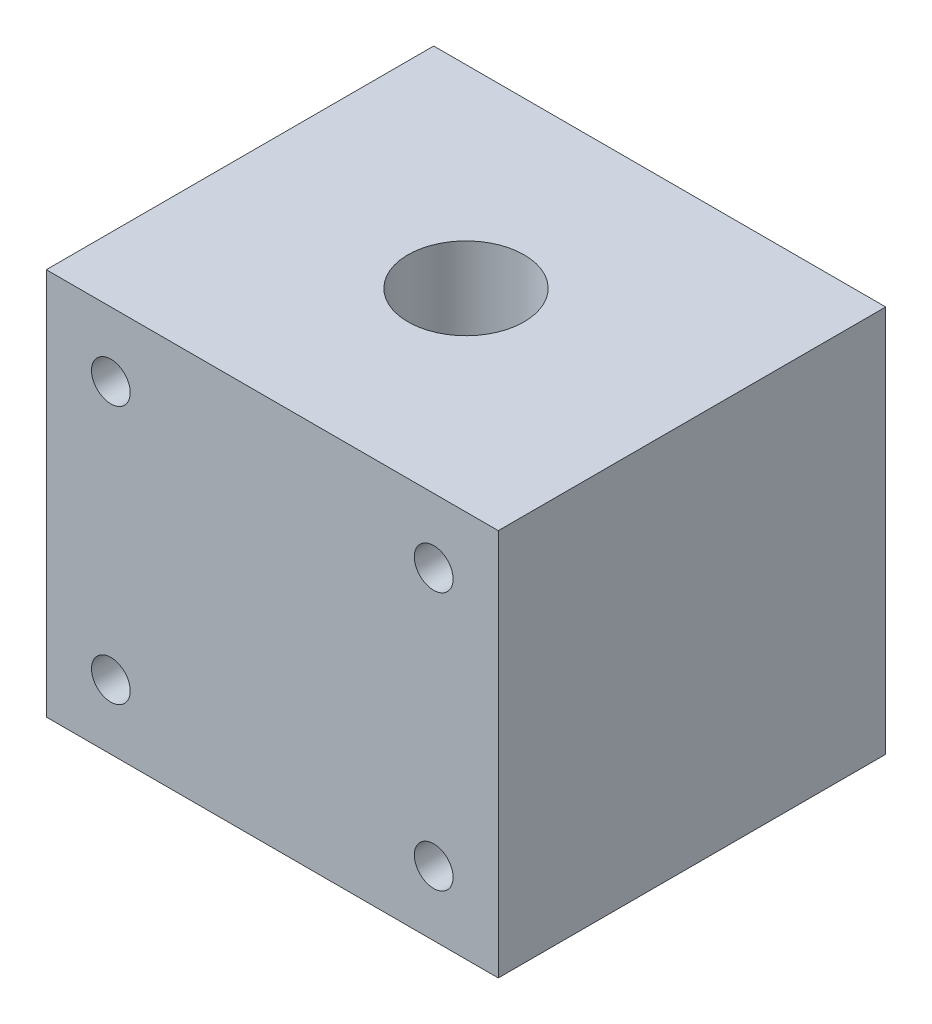
ISO-10303-21;
HEADER;
FILE_DESCRIPTION(('STEP AP214'),'2;1');
FILE_NAME('part.step','',(''),(''),'','','');
FILE_SCHEMA(('AUTOMOTIVE_DESIGN { 1 0 10303 214 1 1 1 1 }'));
ENDSEC;
DATA;
#1=APPLICATION_CONTEXT('core data for automotive mechanical design processes');
#2=APPLICATION_PROTOCOL_DEFINITION('international standard','automotive_design',2000,#1);
#3=PRODUCT_CONTEXT('',#1,'mechanical');
#4=PRODUCT('Part','Part','',(#3));
#5=PRODUCT_RELATED_PRODUCT_CATEGORY('part','',(#4));
#6=PRODUCT_DEFINITION_FORMATION('','',#4);
#7=PRODUCT_DEFINITION_CONTEXT('part definition',#1,'design');
#8=PRODUCT_DEFINITION('design','',#6,#7);
#9=PRODUCT_DEFINITION_SHAPE('','',#8);
#10=(LENGTH_UNIT() NAMED_UNIT(*) SI_UNIT(.MILLI.,.METRE.));
#11=(NAMED_UNIT(*) PLANE_ANGLE_UNIT() SI_UNIT($,.RADIAN.));
#12=(NAMED_UNIT(*) SI_UNIT($,.STERADIAN.) SOLID_ANGLE_UNIT());
#13=UNCERTAINTY_MEASURE_WITH_UNIT(LENGTH_MEASURE(1.E-05),#10,'distance_accuracy_value','');
#14=(GEOMETRIC_REPRESENTATION_CONTEXT(3) GLOBAL_UNCERTAINTY_ASSIGNED_CONTEXT((#13)) GLOBAL_UNIT_ASSIGNED_CONTEXT((#10,
#11,#12)) REPRESENTATION_CONTEXT('',''));
#15=CARTESIAN_POINT('',(0.,0.,0.));
#16=DIRECTION('',(0.,0.,1.));
#17=DIRECTION('',(1.,0.,0.));
#18=AXIS2_PLACEMENT_3D('',#15,#16,#17);
#19=CARTESIAN_POINT('',(17.5,30.,15.));
#20=DIRECTION('',(-1.,0.,0.));
#21=DIRECTION('',(0.,0.,1.));
#22=AXIS2_PLACEMENT_3D('',#19,#20,#21);
#23=PLANE('',#22);
#24=DIRECTION('',(0.,0.,-1.));
#25=VECTOR('',#24,1.);
#26=CARTESIAN_POINT('',(17.5,0.,15.));
#27=LINE('',#26,#25);
#28=CARTESIAN_POINT('',(17.5,0.,15.));
#29=VERTEX_POINT('',#28);
#30=CARTESIAN_POINT('',(17.5,0.,-15.));
#31=VERTEX_POINT('',#30);
#32=EDGE_CURVE('E109',#29,#31,#27,.T.);
#33=ORIENTED_EDGE('',*,*,#32,.T.);
#34=DIRECTION('',(0.,-1.,0.));
#35=VECTOR('',#34,1.);
#36=CARTESIAN_POINT('',(17.5,30.,-15.));
#37=LINE('',#36,#35);
#38=CARTESIAN_POINT('',(17.5,30.,-15.));
#39=VERTEX_POINT('',#38);
#40=EDGE_CURVE('E11',#39,#31,#37,.T.);
#41=ORIENTED_EDGE('',*,*,#40,.F.);
#42=DIRECTION('',(0.,0.,-1.));
#43=VECTOR('',#42,1.);
#44=CARTESIAN_POINT('',(17.5,30.,15.));
#45=LINE('',#44,#43);
#46=CARTESIAN_POINT('',(17.5,30.,15.));
#47=VERTEX_POINT('',#46);
#48=EDGE_CURVE('E92',#47,#39,#45,.T.);
#49=ORIENTED_EDGE('',*,*,#48,.F.);
#50=DIRECTION('',(0.,-1.,0.));
#51=VECTOR('',#50,1.);
#52=CARTESIAN_POINT('',(17.5,30.,15.));
#53=LINE('',#52,#51);
#54=EDGE_CURVE('E105',#47,#29,#53,.T.);
#55=ORIENTED_EDGE('',*,*,#54,.T.);
#56=EDGE_LOOP('',(#33,#41,#49,#55));
#57=FACE_BOUND('',#56,.T.);
#58=ADVANCED_FACE('F39',(#57),#23,.F.);
#59=CARTESIAN_POINT('',(-17.5,30.,-15.));
#60=DIRECTION('',(0.,0.,1.));
#61=DIRECTION('',(1.,0.,0.));
#62=AXIS2_PLACEMENT_3D('',#59,#60,#61);
#63=PLANE('',#62);
#64=DIRECTION('',(-1.,0.,0.));
#65=VECTOR('',#64,1.);
#66=CARTESIAN_POINT('',(-17.5,0.,-15.));
#67=LINE('',#66,#65);
#68=CARTESIAN_POINT('',(-17.5,0.,-15.));
#69=VERTEX_POINT('',#68);
#70=EDGE_CURVE('E97',#31,#69,#67,.T.);
#71=ORIENTED_EDGE('',*,*,#70,.T.);
#72=DIRECTION('',(0.,-1.,0.));
#73=VECTOR('',#72,1.);
#74=CARTESIAN_POINT('',(-17.5,30.,-15.));
#75=LINE('',#74,#73);
#76=CARTESIAN_POINT('',(-17.5,30.,-15.));
#77=VERTEX_POINT('',#76);
#78=EDGE_CURVE('E49',#77,#69,#75,.T.);
#79=ORIENTED_EDGE('',*,*,#78,.F.);
#80=DIRECTION('',(-1.,0.,0.));
#81=VECTOR('',#80,1.);
#82=CARTESIAN_POINT('',(-17.5,30.,-15.));
#83=LINE('',#82,#81);
#84=EDGE_CURVE('E87',#39,#77,#83,.T.);
#85=ORIENTED_EDGE('',*,*,#84,.F.);
#86=ORIENTED_EDGE('',*,*,#40,.T.);
#87=EDGE_LOOP('',(#71,#79,#85,#86));
#88=FACE_BOUND('',#87,.T.);
#89=ADVANCED_FACE('F96',(#88),#63,.F.);
#90=CARTESIAN_POINT('',(-17.5,30.,15.));
#91=DIRECTION('',(1.,0.,0.));
#92=DIRECTION('',(0.,0.,-1.));
#93=AXIS2_PLACEMENT_3D('',#90,#91,#92);
#94=PLANE('',#93);
#95=DIRECTION('',(0.,0.,1.));
#96=VECTOR('',#95,1.);
#97=CARTESIAN_POINT('',(-17.5,0.,15.));
#98=LINE('',#97,#96);
#99=CARTESIAN_POINT('',(-17.5,0.,15.));
#100=VERTEX_POINT('',#99);
#101=EDGE_CURVE('E74',#69,#100,#98,.T.);
#102=ORIENTED_EDGE('',*,*,#101,.T.);
#103=DIRECTION('',(0.,-1.,0.));
#104=VECTOR('',#103,1.);
#105=CARTESIAN_POINT('',(-17.5,30.,15.));
#106=LINE('',#105,#104);
#107=CARTESIAN_POINT('',(-17.5,30.,15.));
#108=VERTEX_POINT('',#107);
#109=EDGE_CURVE('E99',#108,#100,#106,.T.);
#110=ORIENTED_EDGE('',*,*,#109,.F.);
#111=DIRECTION('',(0.,0.,1.));
#112=VECTOR('',#111,1.);
#113=CARTESIAN_POINT('',(-17.5,30.,15.));
#114=LINE('',#113,#112);
#115=EDGE_CURVE('E90',#77,#108,#114,.T.);
#116=ORIENTED_EDGE('',*,*,#115,.F.);
#117=ORIENTED_EDGE('',*,*,#78,.T.);
#118=EDGE_LOOP('',(#102,#110,#116,#117));
#119=FACE_BOUND('',#118,.T.);
#120=ADVANCED_FACE('F101',(#119),#94,.F.);
#121=CARTESIAN_POINT('',(-17.5,30.,15.));
#122=DIRECTION('',(0.,0.,-1.));
#123=DIRECTION('',(-1.,0.,0.));
#124=AXIS2_PLACEMENT_3D('',#121,#122,#123);
#125=PLANE('',#124);
#126=CARTESIAN_POINT('',(-12.5,5.,15.));
#127=DIRECTION('',(0.,0.,1.));
#128=DIRECTION('',(1.,0.,0.));
#129=AXIS2_PLACEMENT_3D('',#126,#127,#128);
#130=CIRCLE('',#129,1.5);
#131=CARTESIAN_POINT('',(-11.,5.,15.));
#132=VERTEX_POINT('',#131);
#133=EDGE_CURVE('E138',#132,#132,#130,.T.);
#134=ORIENTED_EDGE('',*,*,#133,.F.);
#135=EDGE_LOOP('',(#134));
#136=FACE_BOUND('',#135,.T.);
#137=CARTESIAN_POINT('',(12.5,5.,15.));
#138=DIRECTION('',(0.,0.,1.));
#139=DIRECTION('',(1.,0.,0.));
#140=AXIS2_PLACEMENT_3D('',#137,#138,#139);
#141=CIRCLE('',#140,1.5);
#142=CARTESIAN_POINT('',(14.,5.,15.));
#143=VERTEX_POINT('',#142);
#144=EDGE_CURVE('E147',#143,#143,#141,.T.);
#145=ORIENTED_EDGE('',*,*,#144,.F.);
#146=EDGE_LOOP('',(#145));
#147=FACE_BOUND('',#146,.T.);
#148=CARTESIAN_POINT('',(12.5,25.,15.));
#149=DIRECTION('',(0.,0.,1.));
#150=DIRECTION('',(1.,0.,0.));
#151=AXIS2_PLACEMENT_3D('',#148,#149,#150);
#152=CIRCLE('',#151,1.5);
#153=CARTESIAN_POINT('',(14.,25.,15.));
#154=VERTEX_POINT('',#153);
#155=EDGE_CURVE('E155',#154,#154,#152,.T.);
#156=ORIENTED_EDGE('',*,*,#155,.F.);
#157=EDGE_LOOP('',(#156));
#158=FACE_BOUND('',#157,.T.);
#159=CARTESIAN_POINT('',(-12.5,25.,15.));
#160=DIRECTION('',(0.,0.,1.));
#161=DIRECTION('',(1.,0.,0.));
#162=AXIS2_PLACEMENT_3D('',#159,#160,#161);
#163=CIRCLE('',#162,1.5);
#164=CARTESIAN_POINT('',(-11.,25.,15.));
#165=VERTEX_POINT('',#164);
#166=EDGE_CURVE('E130',#165,#165,#163,.T.);
#167=ORIENTED_EDGE('',*,*,#166,.F.);
#168=EDGE_LOOP('',(#167));
#169=FACE_BOUND('',#168,.T.);
#170=DIRECTION('',(1.,0.,0.));
#171=VECTOR('',#170,1.);
#172=CARTESIAN_POINT('',(-17.5,0.,15.));
#173=LINE('',#172,#171);
#174=EDGE_CURVE('E80',#100,#29,#173,.T.);
#175=ORIENTED_EDGE('',*,*,#174,.T.);
#176=ORIENTED_EDGE('',*,*,#54,.F.);
#177=DIRECTION('',(1.,0.,0.));
#178=VECTOR('',#177,1.);
#179=CARTESIAN_POINT('',(-17.5,30.,15.));
#180=LINE('',#179,#178);
#181=EDGE_CURVE('E57',#108,#47,#180,.T.);
#182=ORIENTED_EDGE('',*,*,#181,.F.);
#183=ORIENTED_EDGE('',*,*,#109,.T.);
#184=EDGE_LOOP('',(#175,#176,#182,#183));
#185=FACE_BOUND('',#184,.T.);
#186=ADVANCED_FACE('F123',(#136,#147,#158,#169,#185),#125,.F.);
#187=CARTESIAN_POINT('',(0.,30.,0.));
#188=DIRECTION('',(0.,-1.,0.));
#189=DIRECTION('',(0.,0.,-1.));
#190=AXIS2_PLACEMENT_3D('',#187,#188,#189);
#191=PLANE('',#190);
#192=CARTESIAN_POINT('',(0.,30.,0.));
#193=DIRECTION('',(0.,-1.,0.));
#194=DIRECTION('',(0.,0.,-1.));
#195=AXIS2_PLACEMENT_3D('',#192,#193,#194);
#196=CIRCLE('',#195,4.5);
#197=CARTESIAN_POINT('',(0.,30.,-4.5));
#198=VERTEX_POINT('',#197);
#199=EDGE_CURVE('E169',#198,#198,#196,.T.);
#200=ORIENTED_EDGE('',*,*,#199,.T.);
#201=EDGE_LOOP('',(#200));
#202=FACE_BOUND('',#201,.T.);
#203=ORIENTED_EDGE('',*,*,#48,.T.);
#204=ORIENTED_EDGE('',*,*,#84,.T.);
#205=ORIENTED_EDGE('',*,*,#115,.T.);
#206=ORIENTED_EDGE('',*,*,#181,.T.);
#207=EDGE_LOOP('',(#203,#204,#205,#206));
#208=FACE_BOUND('',#207,.T.);
#209=ADVANCED_FACE('F88',(#202,#208),#191,.F.);
#210=CARTESIAN_POINT('',(0.,0.,0.));
#211=DIRECTION('',(0.,-1.,0.));
#212=DIRECTION('',(0.,0.,-1.));
#213=AXIS2_PLACEMENT_3D('',#210,#211,#212);
#214=PLANE('',#213);
#215=CARTESIAN_POINT('',(0.,0.,0.));
#216=DIRECTION('',(0.,-1.,0.));
#217=DIRECTION('',(0.,0.,-1.));
#218=AXIS2_PLACEMENT_3D('',#215,#216,#217);
#219=CIRCLE('',#218,11.);
#220=CARTESIAN_POINT('',(0.,0.,-11.));
#221=VERTEX_POINT('',#220);
#222=EDGE_CURVE('E162',#221,#221,#219,.T.);
#223=ORIENTED_EDGE('',*,*,#222,.F.);
#224=EDGE_LOOP('',(#223));
#225=FACE_BOUND('',#224,.T.);
#226=ORIENTED_EDGE('',*,*,#32,.F.);
#227=ORIENTED_EDGE('',*,*,#174,.F.);
#228=ORIENTED_EDGE('',*,*,#101,.F.);
#229=ORIENTED_EDGE('',*,*,#70,.F.);
#230=EDGE_LOOP('',(#226,#227,#228,#229));
#231=FACE_BOUND('',#230,.T.);
#232=ADVANCED_FACE('F126',(#225,#231),#214,.T.);
#233=CARTESIAN_POINT('',(-12.5,25.,5.));
#234=DIRECTION('',(0.,0.,1.));
#235=DIRECTION('',(1.,0.,0.));
#236=AXIS2_PLACEMENT_3D('',#233,#234,#235);
#237=CYLINDRICAL_SURFACE('',#236,1.5);
#238=CARTESIAN_POINT('',(-12.5,25.,5.));
#239=DIRECTION('',(0.,0.,1.));
#240=DIRECTION('',(1.,0.,0.));
#241=AXIS2_PLACEMENT_3D('',#238,#239,#240);
#242=CIRCLE('',#241,1.5);
#243=CARTESIAN_POINT('',(-11.,25.,5.));
#244=VERTEX_POINT('',#243);
#245=EDGE_CURVE('E113',#244,#244,#242,.T.);
#246=ORIENTED_EDGE('',*,*,#245,.F.);
#247=EDGE_LOOP('',(#246));
#248=FACE_BOUND('',#247,.T.);
#249=ORIENTED_EDGE('',*,*,#166,.T.);
#250=EDGE_LOOP('',(#249));
#251=FACE_BOUND('',#250,.T.);
#252=ADVANCED_FACE('F204',(#248,#251),#237,.F.);
#253=CARTESIAN_POINT('',(-12.5,25.,5.));
#254=DIRECTION('',(0.,0.,1.));
#255=DIRECTION('',(1.,0.,0.));
#256=AXIS2_PLACEMENT_3D('',#253,#254,#255);
#257=PLANE('',#256);
#258=ORIENTED_EDGE('',*,*,#245,.T.);
#259=EDGE_LOOP('',(#258));
#260=FACE_BOUND('',#259,.T.);
#261=ADVANCED_FACE('F210',(#260),#257,.T.);
#262=CARTESIAN_POINT('',(12.5,25.,5.));
#263=DIRECTION('',(0.,0.,1.));
#264=DIRECTION('',(1.,0.,0.));
#265=AXIS2_PLACEMENT_3D('',#262,#263,#264);
#266=CYLINDRICAL_SURFACE('',#265,1.5);
#267=CARTESIAN_POINT('',(12.5,25.,5.));
#268=DIRECTION('',(0.,0.,1.));
#269=DIRECTION('',(1.,0.,0.));
#270=AXIS2_PLACEMENT_3D('',#267,#268,#269);
#271=CIRCLE('',#270,1.5);
#272=CARTESIAN_POINT('',(14.,25.,5.));
#273=VERTEX_POINT('',#272);
#274=EDGE_CURVE('E134',#273,#273,#271,.T.);
#275=ORIENTED_EDGE('',*,*,#274,.F.);
#276=EDGE_LOOP('',(#275));
#277=FACE_BOUND('',#276,.T.);
#278=ORIENTED_EDGE('',*,*,#155,.T.);
#279=EDGE_LOOP('',(#278));
#280=FACE_BOUND('',#279,.T.);
#281=ADVANCED_FACE('F214',(#277,#280),#266,.F.);
#282=CARTESIAN_POINT('',(12.5,25.,5.));
#283=DIRECTION('',(0.,0.,1.));
#284=DIRECTION('',(1.,0.,0.));
#285=AXIS2_PLACEMENT_3D('',#282,#283,#284);
#286=PLANE('',#285);
#287=ORIENTED_EDGE('',*,*,#274,.T.);
#288=EDGE_LOOP('',(#287));
#289=FACE_BOUND('',#288,.T.);
#290=ADVANCED_FACE('F228',(#289),#286,.T.);
#291=CARTESIAN_POINT('',(12.5,5.,5.));
#292=DIRECTION('',(0.,0.,1.));
#293=DIRECTION('',(1.,0.,0.));
#294=AXIS2_PLACEMENT_3D('',#291,#292,#293);
#295=CYLINDRICAL_SURFACE('',#294,1.5);
#296=CARTESIAN_POINT('',(12.5,5.,5.));
#297=DIRECTION('',(0.,0.,1.));
#298=DIRECTION('',(1.,0.,0.));
#299=AXIS2_PLACEMENT_3D('',#296,#297,#298);
#300=CIRCLE('',#299,1.5);
#301=CARTESIAN_POINT('',(14.,5.,5.));
#302=VERTEX_POINT('',#301);
#303=EDGE_CURVE('E151',#302,#302,#300,.T.);
#304=ORIENTED_EDGE('',*,*,#303,.F.);
#305=EDGE_LOOP('',(#304));
#306=FACE_BOUND('',#305,.T.);
#307=ORIENTED_EDGE('',*,*,#144,.T.);
#308=EDGE_LOOP('',(#307));
#309=FACE_BOUND('',#308,.T.);
#310=ADVANCED_FACE('F225',(#306,#309),#295,.F.);
#311=CARTESIAN_POINT('',(12.5,5.,5.));
#312=DIRECTION('',(0.,0.,1.));
#313=DIRECTION('',(1.,0.,0.));
#314=AXIS2_PLACEMENT_3D('',#311,#312,#313);
#315=PLANE('',#314);
#316=ORIENTED_EDGE('',*,*,#303,.T.);
#317=EDGE_LOOP('',(#316));
#318=FACE_BOUND('',#317,.T.);
#319=ADVANCED_FACE('F220',(#318),#315,.T.);
#320=CARTESIAN_POINT('',(-12.5,5.,5.));
#321=DIRECTION('',(0.,0.,1.));
#322=DIRECTION('',(1.,0.,0.));
#323=AXIS2_PLACEMENT_3D('',#320,#321,#322);
#324=CYLINDRICAL_SURFACE('',#323,1.5);
#325=CARTESIAN_POINT('',(-12.5,5.,5.));
#326=DIRECTION('',(0.,0.,1.));
#327=DIRECTION('',(1.,0.,0.));
#328=AXIS2_PLACEMENT_3D('',#325,#326,#327);
#329=CIRCLE('',#328,1.5);
#330=CARTESIAN_POINT('',(-11.,5.,5.));
#331=VERTEX_POINT('',#330);
#332=EDGE_CURVE('E142',#331,#331,#329,.T.);
#333=ORIENTED_EDGE('',*,*,#332,.F.);
#334=EDGE_LOOP('',(#333));
#335=FACE_BOUND('',#334,.T.);
#336=ORIENTED_EDGE('',*,*,#133,.T.);
#337=EDGE_LOOP('',(#336));
#338=FACE_BOUND('',#337,.T.);
#339=ADVANCED_FACE('F216',(#335,#338),#324,.F.);
#340=CARTESIAN_POINT('',(-12.5,5.,5.));
#341=DIRECTION('',(0.,0.,1.));
#342=DIRECTION('',(1.,0.,0.));
#343=AXIS2_PLACEMENT_3D('',#340,#341,#342);
#344=PLANE('',#343);
#345=ORIENTED_EDGE('',*,*,#332,.T.);
#346=EDGE_LOOP('',(#345));
#347=FACE_BOUND('',#346,.T.);
#348=ADVANCED_FACE('F219',(#347),#344,.T.);
#349=CARTESIAN_POINT('',(0.,3.,0.));
#350=DIRECTION('',(0.,-1.,0.));
#351=DIRECTION('',(0.,0.,-1.));
#352=AXIS2_PLACEMENT_3D('',#349,#350,#351);
#353=CYLINDRICAL_SURFACE('',#352,11.);
#354=CARTESIAN_POINT('',(0.,3.,0.));
#355=DIRECTION('',(0.,-1.,0.));
#356=DIRECTION('',(0.,0.,-1.));
#357=AXIS2_PLACEMENT_3D('',#354,#355,#356);
#358=CIRCLE('',#357,11.);
#359=CARTESIAN_POINT('',(0.,3.,-11.));
#360=VERTEX_POINT('',#359);
#361=EDGE_CURVE('E143',#360,#360,#358,.T.);
#362=ORIENTED_EDGE('',*,*,#361,.F.);
#363=EDGE_LOOP('',(#362));
#364=FACE_BOUND('',#363,.T.);
#365=ORIENTED_EDGE('',*,*,#222,.T.);
#366=EDGE_LOOP('',(#365));
#367=FACE_BOUND('',#366,.T.);
#368=ADVANCED_FACE('F188',(#364,#367),#353,.F.);
#369=CARTESIAN_POINT('',(0.,3.,0.));
#370=DIRECTION('',(0.,-1.,0.));
#371=DIRECTION('',(0.,0.,-1.));
#372=AXIS2_PLACEMENT_3D('',#369,#370,#371);
#373=PLANE('',#372);
#374=CARTESIAN_POINT('',(0.,3.,0.));
#375=DIRECTION('',(0.,-1.,0.));
#376=DIRECTION('',(0.,0.,-1.));
#377=AXIS2_PLACEMENT_3D('',#374,#375,#376);
#378=CIRCLE('',#377,4.5);
#379=CARTESIAN_POINT('',(0.,3.,-4.5));
#380=VERTEX_POINT('',#379);
#381=EDGE_CURVE('E42',#380,#380,#378,.F.);
#382=ORIENTED_EDGE('',*,*,#381,.T.);
#383=EDGE_LOOP('',(#382));
#384=FACE_BOUND('',#383,.T.);
#385=ORIENTED_EDGE('',*,*,#361,.T.);
#386=EDGE_LOOP('',(#385));
#387=FACE_BOUND('',#386,.T.);
#388=ADVANCED_FACE('F178',(#384,#387),#373,.T.);
#389=CARTESIAN_POINT('',(0.,0.,0.));
#390=DIRECTION('',(0.,1.,0.));
#391=DIRECTION('',(0.,0.,1.));
#392=AXIS2_PLACEMENT_3D('',#389,#390,#391);
#393=CYLINDRICAL_SURFACE('',#392,4.5);
#394=ORIENTED_EDGE('',*,*,#381,.F.);
#395=EDGE_LOOP('',(#394));
#396=FACE_BOUND('',#395,.T.);
#397=ORIENTED_EDGE('',*,*,#199,.F.);
#398=EDGE_LOOP('',(#397));
#399=FACE_BOUND('',#398,.T.);
#400=ADVANCED_FACE('F181',(#396,#399),#393,.F.);
#401=CLOSED_SHELL('',(#58,#89,#120,#186,#209,#232,#252,#261,#281,#290,#310,#319,#339,#348,#368,
#388,#400));
#402=MANIFOLD_SOLID_BREP('B2',#401);
#403=ADVANCED_BREP_SHAPE_REPRESENTATION('',(#18,#402),#14);
#404=SHAPE_DEFINITION_REPRESENTATION(#9,#403);
ENDSEC;
END-ISO-10303-21;
